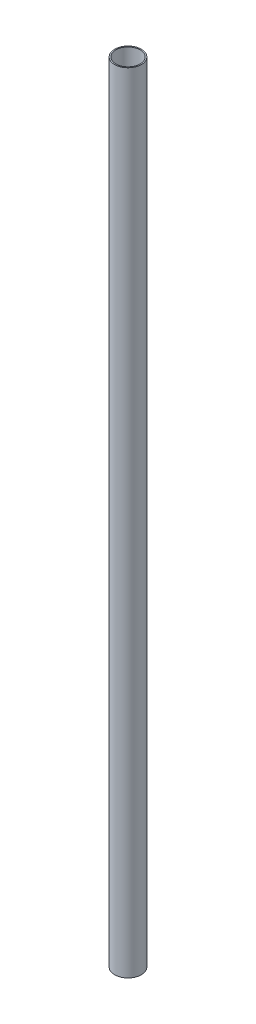
ISO-10303-21;
HEADER;
FILE_DESCRIPTION(('STEP AP214'),'2;1');
FILE_NAME('part.step','',(''),(''),'','','');
FILE_SCHEMA(('AUTOMOTIVE_DESIGN { 1 0 10303 214 1 1 1 1 }'));
ENDSEC;
DATA;
#1=APPLICATION_CONTEXT('core data for automotive mechanical design processes');
#2=APPLICATION_PROTOCOL_DEFINITION('international standard','automotive_design',2000,#1);
#3=PRODUCT_CONTEXT('',#1,'mechanical');
#4=PRODUCT('Part','Part','',(#3));
#5=PRODUCT_RELATED_PRODUCT_CATEGORY('part','',(#4));
#6=PRODUCT_DEFINITION_FORMATION('','',#4);
#7=PRODUCT_DEFINITION_CONTEXT('part definition',#1,'design');
#8=PRODUCT_DEFINITION('design','',#6,#7);
#9=PRODUCT_DEFINITION_SHAPE('','',#8);
#10=(LENGTH_UNIT() NAMED_UNIT(*) SI_UNIT(.MILLI.,.METRE.));
#11=(NAMED_UNIT(*) PLANE_ANGLE_UNIT() SI_UNIT($,.RADIAN.));
#12=(NAMED_UNIT(*) SI_UNIT($,.STERADIAN.) SOLID_ANGLE_UNIT());
#13=UNCERTAINTY_MEASURE_WITH_UNIT(LENGTH_MEASURE(1.E-05),#10,'distance_accuracy_value','');
#14=(GEOMETRIC_REPRESENTATION_CONTEXT(3) GLOBAL_UNCERTAINTY_ASSIGNED_CONTEXT((#13)) GLOBAL_UNIT_ASSIGNED_CONTEXT((#10,
#11,#12)) REPRESENTATION_CONTEXT('',''));
#15=CARTESIAN_POINT('',(0.,0.,0.));
#16=DIRECTION('',(0.,0.,1.));
#17=DIRECTION('',(1.,0.,0.));
#18=AXIS2_PLACEMENT_3D('',#15,#16,#17);
#19=CARTESIAN_POINT('',(0.,4573.,0.));
#20=DIRECTION('',(0.,-1.,0.));
#21=DIRECTION('',(0.,0.,-1.));
#22=AXIS2_PLACEMENT_3D('',#19,#20,#21);
#23=CYLINDRICAL_SURFACE('',#22,90.);
#24=CARTESIAN_POINT('',(0.,4573.,0.));
#25=DIRECTION('',(0.,1.,0.));
#26=DIRECTION('',(0.,0.,1.));
#27=AXIS2_PLACEMENT_3D('',#24,#25,#26);
#28=CIRCLE('',#27,90.);
#29=CARTESIAN_POINT('',(0.,4573.,90.));
#30=VERTEX_POINT('',#29);
#31=EDGE_CURVE('E11',#30,#30,#28,.T.);
#32=ORIENTED_EDGE('',*,*,#31,.F.);
#33=EDGE_LOOP('',(#32));
#34=FACE_BOUND('',#33,.T.);
#35=CARTESIAN_POINT('',(0.,2073.,0.));
#36=DIRECTION('',(0.,-1.,0.));
#37=DIRECTION('',(0.,0.,-1.));
#38=AXIS2_PLACEMENT_3D('',#35,#36,#37);
#39=CIRCLE('',#38,90.);
#40=CARTESIAN_POINT('',(0.,2073.,-90.));
#41=VERTEX_POINT('',#40);
#42=EDGE_CURVE('E50',#41,#41,#39,.T.);
#43=ORIENTED_EDGE('',*,*,#42,.F.);
#44=EDGE_LOOP('',(#43));
#45=FACE_BOUND('',#44,.T.);
#46=ADVANCED_FACE('F44',(#34,#45),#23,.T.);
#47=CARTESIAN_POINT('',(0.,4573.,0.));
#48=DIRECTION('',(0.,1.,0.));
#49=DIRECTION('',(0.,0.,1.));
#50=AXIS2_PLACEMENT_3D('',#47,#48,#49);
#51=PLANE('',#50);
#52=ORIENTED_EDGE('',*,*,#31,.T.);
#53=EDGE_LOOP('',(#52));
#54=FACE_BOUND('',#53,.T.);
#55=ADVANCED_FACE('F59',(#54),#51,.T.);
#56=CARTESIAN_POINT('',(0.,2073.,0.));
#57=DIRECTION('',(0.,-1.,0.));
#58=DIRECTION('',(0.,0.,-1.));
#59=AXIS2_PLACEMENT_3D('',#56,#57,#58);
#60=PLANE('',#59);
#61=ORIENTED_EDGE('',*,*,#42,.T.);
#62=EDGE_LOOP('',(#61));
#63=FACE_BOUND('',#62,.T.);
#64=ADVANCED_FACE('F56',(#63),#60,.T.);
#65=CLOSED_SHELL('',(#46,#55,#64));
#66=MANIFOLD_SOLID_BREP('B2',#65);
#67=CARTESIAN_POINT('',(0.,1673.,0.));
#68=DIRECTION('',(0.,-1.,0.));
#69=DIRECTION('',(0.,0.,-1.));
#70=AXIS2_PLACEMENT_3D('',#67,#68,#69);
#71=CYLINDRICAL_SURFACE('',#70,90.);
#72=CARTESIAN_POINT('',(0.,1673.,0.));
#73=DIRECTION('',(0.,-1.,0.));
#74=DIRECTION('',(0.,0.,-1.));
#75=AXIS2_PLACEMENT_3D('',#72,#73,#74);
#76=CIRCLE('',#75,90.);
#77=CARTESIAN_POINT('',(0.,1673.,-90.));
#78=VERTEX_POINT('',#77);
#79=EDGE_CURVE('E43',#78,#78,#76,.T.);
#80=CARTESIAN_POINT('',(0.,0.,0.));
#81=DIRECTION('',(0.,-1.,0.));
#82=DIRECTION('',(0.,0.,-1.));
#83=AXIS2_PLACEMENT_3D('',#80,#81,#82);
#84=CIRCLE('',#83,90.);
#85=CARTESIAN_POINT('',(0.,2.22044604925031E-13,-90.));
#86=VERTEX_POINT('',#85);
#87=EDGE_CURVE('E110',#86,#86,#84,.T.);
#88=CARTESIAN_POINT('',(0.,1673.,-90.));
#89=CARTESIAN_POINT('',(0.,1655.57291666667,-90.));
#90=CARTESIAN_POINT('',(0.,1638.14583333333,-90.));
#91=CARTESIAN_POINT('',(0.,1603.29166666667,-90.));
#92=CARTESIAN_POINT('',(0.,1585.86458333333,-90.));
#93=CARTESIAN_POINT('',(0.,1551.01041666667,-90.));
#94=CARTESIAN_POINT('',(0.,1533.58333333333,-90.));
#95=CARTESIAN_POINT('',(0.,1498.72916666667,-90.));
#96=CARTESIAN_POINT('',(0.,1481.30208333333,-90.));
#97=CARTESIAN_POINT('',(0.,1446.44791666667,-90.));
#98=CARTESIAN_POINT('',(0.,1429.02083333333,-90.));
#99=CARTESIAN_POINT('',(0.,1394.16666666667,-90.));
#100=CARTESIAN_POINT('',(0.,1376.73958333333,-90.));
#101=CARTESIAN_POINT('',(0.,1341.88541666667,-90.));
#102=CARTESIAN_POINT('',(0.,1324.45833333333,-90.));
#103=CARTESIAN_POINT('',(0.,1289.60416666667,-90.));
#104=CARTESIAN_POINT('',(0.,1272.17708333333,-90.));
#105=CARTESIAN_POINT('',(0.,1237.32291666667,-90.));
#106=CARTESIAN_POINT('',(0.,1219.89583333333,-90.));
#107=CARTESIAN_POINT('',(0.,1185.04166666667,-90.));
#108=CARTESIAN_POINT('',(0.,1167.61458333333,-90.));
#109=CARTESIAN_POINT('',(0.,1132.76041666667,-90.));
#110=CARTESIAN_POINT('',(0.,1115.33333333333,-90.));
#111=CARTESIAN_POINT('',(0.,1080.47916666667,-90.));
#112=CARTESIAN_POINT('',(0.,1063.05208333333,-90.));
#113=CARTESIAN_POINT('',(0.,1028.19791666667,-90.));
#114=CARTESIAN_POINT('',(0.,1010.77083333333,-90.));
#115=CARTESIAN_POINT('',(0.,975.916666666667,-90.));
#116=CARTESIAN_POINT('',(0.,958.489583333333,-90.));
#117=CARTESIAN_POINT('',(0.,923.635416666667,-90.));
#118=CARTESIAN_POINT('',(0.,906.208333333333,-90.));
#119=CARTESIAN_POINT('',(0.,871.354166666667,-90.));
#120=CARTESIAN_POINT('',(0.,853.927083333333,-90.));
#121=CARTESIAN_POINT('',(0.,819.072916666667,-90.));
#122=CARTESIAN_POINT('',(0.,801.645833333333,-90.));
#123=CARTESIAN_POINT('',(0.,766.791666666667,-90.));
#124=CARTESIAN_POINT('',(0.,749.364583333333,-90.));
#125=CARTESIAN_POINT('',(0.,714.510416666667,-90.));
#126=CARTESIAN_POINT('',(0.,697.083333333333,-90.));
#127=CARTESIAN_POINT('',(0.,662.229166666667,-90.));
#128=CARTESIAN_POINT('',(0.,644.802083333334,-90.));
#129=CARTESIAN_POINT('',(0.,609.947916666667,-90.));
#130=CARTESIAN_POINT('',(0.,592.520833333334,-90.));
#131=CARTESIAN_POINT('',(0.,557.666666666667,-90.));
#132=CARTESIAN_POINT('',(0.,540.239583333334,-90.));
#133=CARTESIAN_POINT('',(0.,505.385416666667,-90.));
#134=CARTESIAN_POINT('',(0.,487.958333333334,-90.));
#135=CARTESIAN_POINT('',(0.,453.104166666667,-90.));
#136=CARTESIAN_POINT('',(0.,435.677083333334,-90.));
#137=CARTESIAN_POINT('',(0.,400.822916666667,-90.));
#138=CARTESIAN_POINT('',(0.,383.395833333334,-90.));
#139=CARTESIAN_POINT('',(0.,348.541666666667,-90.));
#140=CARTESIAN_POINT('',(0.,331.114583333334,-90.));
#141=CARTESIAN_POINT('',(0.,296.260416666667,-90.));
#142=CARTESIAN_POINT('',(0.,278.833333333334,-90.));
#143=CARTESIAN_POINT('',(0.,243.979166666667,-90.));
#144=CARTESIAN_POINT('',(0.,226.552083333334,-90.));
#145=CARTESIAN_POINT('',(0.,191.697916666667,-90.));
#146=CARTESIAN_POINT('',(0.,174.270833333334,-90.));
#147=CARTESIAN_POINT('',(0.,139.416666666667,-90.));
#148=CARTESIAN_POINT('',(0.,121.989583333334,-90.));
#149=CARTESIAN_POINT('',(0.,87.135416666667,-90.));
#150=CARTESIAN_POINT('',(0.,69.7083333333336,-90.));
#151=CARTESIAN_POINT('',(0.,34.8541666666669,-90.));
#152=CARTESIAN_POINT('',(0.,17.4270833333336,-90.));
#153=CARTESIAN_POINT('',(0.,2.22044604925031E-13,-90.));
#154=B_SPLINE_CURVE_WITH_KNOTS('',3,(#88,#89,#90,#91,#92,#93,#94,#95,#96,#97,#98,#99,#100,#101,
#102,#103,#104,#105,#106,#107,#108,#109,#110,#111,#112,#113,#114,#115,#116,#117,#118,#119,#120,
#121,#122,#123,#124,#125,#126,#127,#128,#129,#130,#131,#132,#133,#134,#135,#136,#137,#138,#139,
#140,#141,#142,#143,#144,#145,#146,#147,#148,#149,#150,#151,#152,#153),.UNSPECIFIED.,.F.,.F.,(4,
2,2,2,2,2,2,2,2,2,2,2,2,2,2,2,2,2,2,2,2,2,2,2,2,2,2,2,2,2,2,2,4),(0.,52.2812500000001,104.5625,
156.84375,209.125,261.40625,313.6875,365.96875,418.25,470.53125,522.8125,575.09375,627.375,
679.65625,731.9375,784.21875,836.5,888.78125,941.0625,993.34375,1045.625,1097.90625,1150.1875,
1202.46875,1254.75,1307.03125,1359.3125,1411.59375,1463.875,1516.15625,1568.4375,1620.71875,
1673.),.UNSPECIFIED.);
#155=EDGE_CURVE('BSEAM107',#78,#86,#154,.T.);
#156=ORIENTED_EDGE('',*,*,#79,.T.);
#157=ORIENTED_EDGE('',*,*,#87,.F.);
#158=ORIENTED_EDGE('',*,*,#155,.T.);
#159=ORIENTED_EDGE('',*,*,#155,.F.);
#160=EDGE_LOOP('',(#156,#158,#157,#159));
#161=FACE_BOUND('',#160,.T.);
#162=ADVANCED_FACE('F107',(#161),#71,.T.);
#163=CARTESIAN_POINT('',(0.,1673.,0.));
#164=DIRECTION('',(0.,-1.,0.));
#165=DIRECTION('',(0.,0.,-1.));
#166=AXIS2_PLACEMENT_3D('',#163,#164,#165);
#167=PLANE('',#166);
#168=CARTESIAN_POINT('',(0.,1673.,0.));
#169=DIRECTION('',(0.,-1.,0.));
#170=DIRECTION('',(0.,0.,-1.));
#171=AXIS2_PLACEMENT_3D('',#168,#169,#170);
#172=CIRCLE('',#171,50.);
#173=CARTESIAN_POINT('',(0.,1673.,-50.));
#174=VERTEX_POINT('',#173);
#175=EDGE_CURVE('E117',#174,#174,#172,.T.);
#176=ORIENTED_EDGE('',*,*,#175,.T.);
#177=EDGE_LOOP('',(#176));
#178=FACE_BOUND('',#177,.T.);
#179=ORIENTED_EDGE('',*,*,#79,.F.);
#180=EDGE_LOOP('',(#179));
#181=FACE_BOUND('',#180,.T.);
#182=ADVANCED_FACE('F125',(#178,#181),#167,.F.);
#183=CARTESIAN_POINT('',(0.,0.,0.));
#184=DIRECTION('',(0.,-1.,0.));
#185=DIRECTION('',(0.,0.,-1.));
#186=AXIS2_PLACEMENT_3D('',#183,#184,#185);
#187=PLANE('',#186);
#188=CARTESIAN_POINT('',(0.,0.,0.));
#189=DIRECTION('',(0.,-1.,0.));
#190=DIRECTION('',(0.,0.,-1.));
#191=AXIS2_PLACEMENT_3D('',#188,#189,#190);
#192=CIRCLE('',#191,50.);
#193=CARTESIAN_POINT('',(0.,2.22044604925031E-13,-50.));
#194=VERTEX_POINT('',#193);
#195=EDGE_CURVE('E119',#194,#194,#192,.T.);
#196=ORIENTED_EDGE('',*,*,#195,.F.);
#197=EDGE_LOOP('',(#196));
#198=FACE_BOUND('',#197,.T.);
#199=ORIENTED_EDGE('',*,*,#87,.T.);
#200=EDGE_LOOP('',(#199));
#201=FACE_BOUND('',#200,.T.);
#202=ADVANCED_FACE('F131',(#198,#201),#187,.T.);
#203=CARTESIAN_POINT('',(0.,1673.,0.));
#204=DIRECTION('',(0.,-1.,0.));
#205=DIRECTION('',(0.,0.,-1.));
#206=AXIS2_PLACEMENT_3D('',#203,#204,#205);
#207=CYLINDRICAL_SURFACE('',#206,50.);
#208=CARTESIAN_POINT('',(0.,1673.,-50.));
#209=CARTESIAN_POINT('',(0.,1655.57291666667,-50.));
#210=CARTESIAN_POINT('',(0.,1638.14583333333,-50.));
#211=CARTESIAN_POINT('',(0.,1603.29166666667,-50.));
#212=CARTESIAN_POINT('',(0.,1585.86458333333,-50.));
#213=CARTESIAN_POINT('',(0.,1551.01041666667,-50.));
#214=CARTESIAN_POINT('',(0.,1533.58333333333,-50.));
#215=CARTESIAN_POINT('',(0.,1498.72916666667,-50.));
#216=CARTESIAN_POINT('',(0.,1481.30208333333,-50.));
#217=CARTESIAN_POINT('',(0.,1446.44791666667,-50.));
#218=CARTESIAN_POINT('',(0.,1429.02083333333,-50.));
#219=CARTESIAN_POINT('',(0.,1394.16666666667,-50.));
#220=CARTESIAN_POINT('',(0.,1376.73958333333,-50.));
#221=CARTESIAN_POINT('',(0.,1341.88541666667,-50.));
#222=CARTESIAN_POINT('',(0.,1324.45833333333,-50.));
#223=CARTESIAN_POINT('',(0.,1289.60416666667,-50.));
#224=CARTESIAN_POINT('',(0.,1272.17708333333,-50.));
#225=CARTESIAN_POINT('',(0.,1237.32291666667,-50.));
#226=CARTESIAN_POINT('',(0.,1219.89583333333,-50.));
#227=CARTESIAN_POINT('',(0.,1185.04166666667,-50.));
#228=CARTESIAN_POINT('',(0.,1167.61458333333,-50.));
#229=CARTESIAN_POINT('',(0.,1132.76041666667,-50.));
#230=CARTESIAN_POINT('',(0.,1115.33333333333,-50.));
#231=CARTESIAN_POINT('',(0.,1080.47916666667,-50.));
#232=CARTESIAN_POINT('',(0.,1063.05208333333,-50.));
#233=CARTESIAN_POINT('',(0.,1028.19791666667,-50.));
#234=CARTESIAN_POINT('',(0.,1010.77083333333,-50.));
#235=CARTESIAN_POINT('',(0.,975.916666666667,-50.));
#236=CARTESIAN_POINT('',(0.,958.489583333333,-50.));
#237=CARTESIAN_POINT('',(0.,923.635416666667,-50.));
#238=CARTESIAN_POINT('',(0.,906.208333333333,-50.));
#239=CARTESIAN_POINT('',(0.,871.354166666667,-50.));
#240=CARTESIAN_POINT('',(0.,853.927083333333,-50.));
#241=CARTESIAN_POINT('',(0.,819.072916666667,-50.));
#242=CARTESIAN_POINT('',(0.,801.645833333333,-50.));
#243=CARTESIAN_POINT('',(0.,766.791666666667,-50.));
#244=CARTESIAN_POINT('',(0.,749.364583333333,-50.));
#245=CARTESIAN_POINT('',(0.,714.510416666667,-50.));
#246=CARTESIAN_POINT('',(0.,697.083333333333,-50.));
#247=CARTESIAN_POINT('',(0.,662.229166666667,-50.));
#248=CARTESIAN_POINT('',(0.,644.802083333334,-50.));
#249=CARTESIAN_POINT('',(0.,609.947916666667,-50.));
#250=CARTESIAN_POINT('',(0.,592.520833333334,-50.));
#251=CARTESIAN_POINT('',(0.,557.666666666667,-50.));
#252=CARTESIAN_POINT('',(0.,540.239583333334,-50.));
#253=CARTESIAN_POINT('',(0.,505.385416666667,-50.));
#254=CARTESIAN_POINT('',(0.,487.958333333334,-50.));
#255=CARTESIAN_POINT('',(0.,453.104166666667,-50.));
#256=CARTESIAN_POINT('',(0.,435.677083333334,-50.));
#257=CARTESIAN_POINT('',(0.,400.822916666667,-50.));
#258=CARTESIAN_POINT('',(0.,383.395833333334,-50.));
#259=CARTESIAN_POINT('',(0.,348.541666666667,-50.));
#260=CARTESIAN_POINT('',(0.,331.114583333334,-50.));
#261=CARTESIAN_POINT('',(0.,296.260416666667,-50.));
#262=CARTESIAN_POINT('',(0.,278.833333333334,-50.));
#263=CARTESIAN_POINT('',(0.,243.979166666667,-50.));
#264=CARTESIAN_POINT('',(0.,226.552083333334,-50.));
#265=CARTESIAN_POINT('',(0.,191.697916666667,-50.));
#266=CARTESIAN_POINT('',(0.,174.270833333334,-50.));
#267=CARTESIAN_POINT('',(0.,139.416666666667,-50.));
#268=CARTESIAN_POINT('',(0.,121.989583333334,-50.));
#269=CARTESIAN_POINT('',(0.,87.135416666667,-50.));
#270=CARTESIAN_POINT('',(0.,69.7083333333336,-50.));
#271=CARTESIAN_POINT('',(0.,34.8541666666669,-50.));
#272=CARTESIAN_POINT('',(0.,17.4270833333336,-50.));
#273=CARTESIAN_POINT('',(0.,2.22044604925031E-13,-50.));
#274=B_SPLINE_CURVE_WITH_KNOTS('',3,(#208,#209,#210,#211,#212,#213,#214,#215,#216,#217,#218,
#219,#220,#221,#222,#223,#224,#225,#226,#227,#228,#229,#230,#231,#232,#233,#234,#235,#236,#237,
#238,#239,#240,#241,#242,#243,#244,#245,#246,#247,#248,#249,#250,#251,#252,#253,#254,#255,#256,
#257,#258,#259,#260,#261,#262,#263,#264,#265,#266,#267,#268,#269,#270,#271,#272,#273),
.UNSPECIFIED.,.F.,.F.,(4,2,2,2,2,2,2,2,2,2,2,2,2,2,2,2,2,2,2,2,2,2,2,2,2,2,2,2,2,2,2,2,4),(0.,
52.2812500000001,104.5625,156.84375,209.125,261.40625,313.6875,365.96875,418.25,470.53125,
522.8125,575.09375,627.375,679.65625,731.9375,784.21875,836.5,888.78125,941.0625,993.34375,
1045.625,1097.90625,1150.1875,1202.46875,1254.75,1307.03125,1359.3125,1411.59375,1463.875,
1516.15625,1568.4375,1620.71875,1673.),.UNSPECIFIED.);
#275=EDGE_CURVE('BSEAM128',#174,#194,#274,.T.);
#276=ORIENTED_EDGE('',*,*,#175,.F.);
#277=ORIENTED_EDGE('',*,*,#195,.T.);
#278=ORIENTED_EDGE('',*,*,#275,.T.);
#279=ORIENTED_EDGE('',*,*,#275,.F.);
#280=EDGE_LOOP('',(#276,#278,#277,#279));
#281=FACE_BOUND('',#280,.T.);
#282=ADVANCED_FACE('F128',(#281),#207,.F.);
#283=CLOSED_SHELL('',(#162,#182,#202,#282));
#284=MANIFOLD_SOLID_BREP('B6',#283);
#285=CARTESIAN_POINT('',(0.,5822.,0.));
#286=DIRECTION('',(0.,1.,0.));
#287=DIRECTION('',(0.,0.,1.));
#288=AXIS2_PLACEMENT_3D('',#285,#286,#287);
#289=PLANE('',#288);
#290=CARTESIAN_POINT('',(0.,5822.,0.));
#291=DIRECTION('',(0.,1.,0.));
#292=DIRECTION('',(0.,0.,1.));
#293=AXIS2_PLACEMENT_3D('',#290,#291,#292);
#294=CIRCLE('',#293,98.5);
#295=CARTESIAN_POINT('',(0.,5822.,98.5));
#296=VERTEX_POINT('',#295);
#297=EDGE_CURVE('E106',#296,#296,#294,.T.);
#298=ORIENTED_EDGE('',*,*,#297,.T.);
#299=EDGE_LOOP('',(#298));
#300=FACE_BOUND('',#299,.T.);
#301=CARTESIAN_POINT('',(0.,5822.,0.));
#302=DIRECTION('',(0.,1.,0.));
#303=DIRECTION('',(0.,0.,1.));
#304=AXIS2_PLACEMENT_3D('',#301,#302,#303);
#305=CIRCLE('',#304,90.);
#306=CARTESIAN_POINT('',(0.,5822.,90.));
#307=VERTEX_POINT('',#306);
#308=EDGE_CURVE('E180',#307,#307,#305,.T.);
#309=ORIENTED_EDGE('',*,*,#308,.F.);
#310=EDGE_LOOP('',(#309));
#311=FACE_BOUND('',#310,.T.);
#312=ADVANCED_FACE('F169',(#300,#311),#289,.T.);
#313=CARTESIAN_POINT('',(0.,0.,0.));
#314=DIRECTION('',(0.,1.,0.));
#315=DIRECTION('',(0.,0.,1.));
#316=AXIS2_PLACEMENT_3D('',#313,#314,#315);
#317=PLANE('',#316);
#318=CARTESIAN_POINT('',(0.,0.,0.));
#319=DIRECTION('',(0.,1.,0.));
#320=DIRECTION('',(0.,0.,1.));
#321=AXIS2_PLACEMENT_3D('',#318,#319,#320);
#322=CIRCLE('',#321,98.5);
#323=CARTESIAN_POINT('',(0.,0.,98.5));
#324=VERTEX_POINT('',#323);
#325=EDGE_CURVE('E173',#324,#324,#322,.T.);
#326=ORIENTED_EDGE('',*,*,#325,.F.);
#327=EDGE_LOOP('',(#326));
#328=FACE_BOUND('',#327,.T.);
#329=CARTESIAN_POINT('',(0.,0.,0.));
#330=DIRECTION('',(0.,1.,0.));
#331=DIRECTION('',(0.,0.,1.));
#332=AXIS2_PLACEMENT_3D('',#329,#330,#331);
#333=CIRCLE('',#332,90.);
#334=CARTESIAN_POINT('',(0.,0.,90.));
#335=VERTEX_POINT('',#334);
#336=EDGE_CURVE('E182',#335,#335,#333,.T.);
#337=ORIENTED_EDGE('',*,*,#336,.T.);
#338=EDGE_LOOP('',(#337));
#339=FACE_BOUND('',#338,.T.);
#340=ADVANCED_FACE('F192',(#328,#339),#317,.F.);
#341=CARTESIAN_POINT('',(0.,5822.,0.));
#342=DIRECTION('',(0.,-1.,0.));
#343=DIRECTION('',(0.,0.,-1.));
#344=AXIS2_PLACEMENT_3D('',#341,#342,#343);
#345=CYLINDRICAL_SURFACE('',#344,98.5);
#346=ORIENTED_EDGE('',*,*,#297,.F.);
#347=EDGE_LOOP('',(#346));
#348=FACE_BOUND('',#347,.T.);
#349=ORIENTED_EDGE('',*,*,#325,.T.);
#350=EDGE_LOOP('',(#349));
#351=FACE_BOUND('',#350,.T.);
#352=ADVANCED_FACE('F171',(#348,#351),#345,.T.);
#353=CARTESIAN_POINT('',(0.,5822.,0.));
#354=DIRECTION('',(0.,-1.,0.));
#355=DIRECTION('',(0.,0.,-1.));
#356=AXIS2_PLACEMENT_3D('',#353,#354,#355);
#357=CYLINDRICAL_SURFACE('',#356,90.);
#358=ORIENTED_EDGE('',*,*,#308,.T.);
#359=EDGE_LOOP('',(#358));
#360=FACE_BOUND('',#359,.T.);
#361=ORIENTED_EDGE('',*,*,#336,.F.);
#362=EDGE_LOOP('',(#361));
#363=FACE_BOUND('',#362,.T.);
#364=ADVANCED_FACE('F188',(#360,#363),#357,.F.);
#365=CLOSED_SHELL('',(#312,#340,#352,#364));
#366=MANIFOLD_SOLID_BREP('B38',#365);
#367=ADVANCED_BREP_SHAPE_REPRESENTATION('',(#18,#66,#284,#366),#14);
#368=SHAPE_DEFINITION_REPRESENTATION(#9,#367);
ENDSEC;
END-ISO-10303-21;
